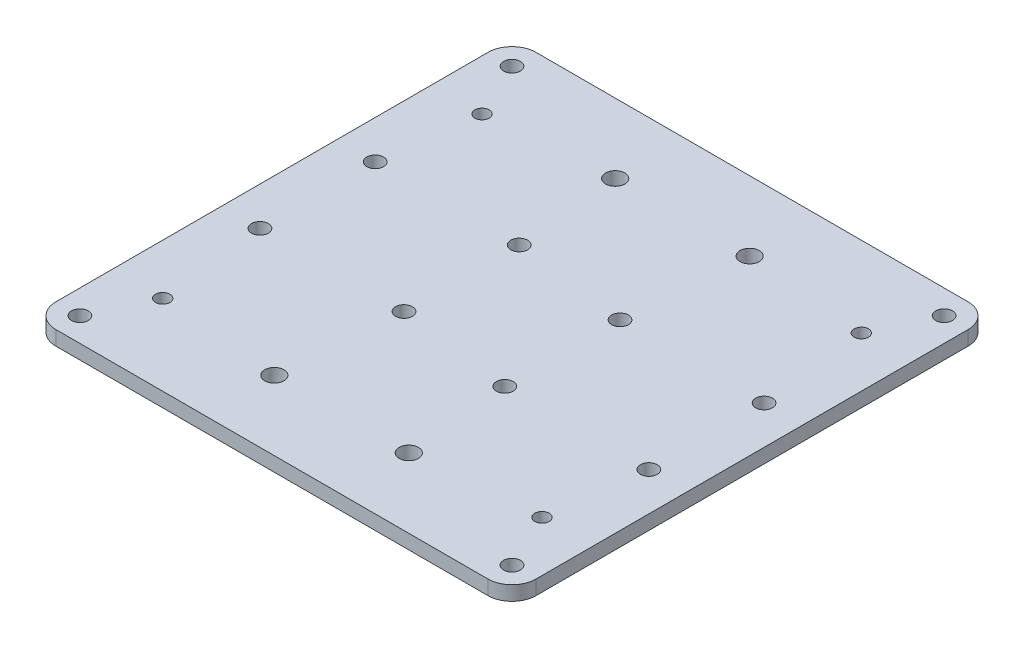
ISO-10303-21;
HEADER;
FILE_DESCRIPTION(('STEP AP214'),'2;1');
FILE_NAME('part.step','',(''),(''),'','','');
FILE_SCHEMA(('AUTOMOTIVE_DESIGN { 1 0 10303 214 1 1 1 1 }'));
ENDSEC;
DATA;
#1=APPLICATION_CONTEXT('core data for automotive mechanical design processes');
#2=APPLICATION_PROTOCOL_DEFINITION('international standard','automotive_design',2000,#1);
#3=PRODUCT_CONTEXT('',#1,'mechanical');
#4=PRODUCT('Part','Part','',(#3));
#5=PRODUCT_RELATED_PRODUCT_CATEGORY('part','',(#4));
#6=PRODUCT_DEFINITION_FORMATION('','',#4);
#7=PRODUCT_DEFINITION_CONTEXT('part definition',#1,'design');
#8=PRODUCT_DEFINITION('design','',#6,#7);
#9=PRODUCT_DEFINITION_SHAPE('','',#8);
#10=(LENGTH_UNIT() NAMED_UNIT(*) SI_UNIT(.MILLI.,.METRE.));
#11=(NAMED_UNIT(*) PLANE_ANGLE_UNIT() SI_UNIT($,.RADIAN.));
#12=(NAMED_UNIT(*) SI_UNIT($,.STERADIAN.) SOLID_ANGLE_UNIT());
#13=UNCERTAINTY_MEASURE_WITH_UNIT(LENGTH_MEASURE(1.E-05),#10,'distance_accuracy_value','');
#14=(GEOMETRIC_REPRESENTATION_CONTEXT(3) GLOBAL_UNCERTAINTY_ASSIGNED_CONTEXT((#13)) GLOBAL_UNIT_ASSIGNED_CONTEXT((#10,
#11,#12)) REPRESENTATION_CONTEXT('',''));
#15=CARTESIAN_POINT('',(0.,0.,0.));
#16=DIRECTION('',(0.,0.,1.));
#17=DIRECTION('',(1.,0.,0.));
#18=AXIS2_PLACEMENT_3D('',#15,#16,#17);
#19=CARTESIAN_POINT('',(45.,3.,45.));
#20=DIRECTION('',(0.,-1.,0.));
#21=DIRECTION('',(0.,0.,-1.));
#22=AXIS2_PLACEMENT_3D('',#19,#20,#21);
#23=PLANE('',#22);
#24=CARTESIAN_POINT('',(45.,3.,45.));
#25=DIRECTION('',(0.,1.,0.));
#26=DIRECTION('',(0.,0.,-1.));
#27=AXIS2_PLACEMENT_3D('',#24,#25,#26);
#28=CIRCLE('',#27,4.99999999999998);
#29=CARTESIAN_POINT('',(45.,3.,50.));
#30=VERTEX_POINT('',#29);
#31=CARTESIAN_POINT('',(50.,3.,45.));
#32=VERTEX_POINT('',#31);
#33=EDGE_CURVE('E147',#30,#32,#28,.T.);
#34=ORIENTED_EDGE('',*,*,#33,.T.);
#35=DIRECTION('',(0.,0.,-1.));
#36=VECTOR('',#35,1.);
#37=CARTESIAN_POINT('',(50.,3.,-45.));
#38=LINE('',#37,#36);
#39=CARTESIAN_POINT('',(50.,3.,-45.));
#40=VERTEX_POINT('',#39);
#41=EDGE_CURVE('E95',#32,#40,#38,.T.);
#42=ORIENTED_EDGE('',*,*,#41,.T.);
#43=CARTESIAN_POINT('',(45.,3.,-45.));
#44=DIRECTION('',(0.,1.,0.));
#45=DIRECTION('',(0.,0.,-1.));
#46=AXIS2_PLACEMENT_3D('',#43,#44,#45);
#47=CIRCLE('',#46,4.99999999999999);
#48=CARTESIAN_POINT('',(45.,3.,-50.));
#49=VERTEX_POINT('',#48);
#50=EDGE_CURVE('E162',#40,#49,#47,.T.);
#51=ORIENTED_EDGE('',*,*,#50,.T.);
#52=DIRECTION('',(-1.,0.,0.));
#53=VECTOR('',#52,1.);
#54=CARTESIAN_POINT('',(-45.,3.,-50.));
#55=LINE('',#54,#53);
#56=CARTESIAN_POINT('',(-45.,3.,-50.));
#57=VERTEX_POINT('',#56);
#58=EDGE_CURVE('E175',#49,#57,#55,.T.);
#59=ORIENTED_EDGE('',*,*,#58,.T.);
#60=CARTESIAN_POINT('',(-45.,3.,-45.));
#61=DIRECTION('',(0.,1.,0.));
#62=DIRECTION('',(0.,0.,-1.));
#63=AXIS2_PLACEMENT_3D('',#60,#61,#62);
#64=CIRCLE('',#63,4.99999999999999);
#65=CARTESIAN_POINT('',(-50.,3.,-45.));
#66=VERTEX_POINT('',#65);
#67=EDGE_CURVE('E114',#57,#66,#64,.T.);
#68=ORIENTED_EDGE('',*,*,#67,.T.);
#69=DIRECTION('',(0.,0.,1.));
#70=VECTOR('',#69,1.);
#71=CARTESIAN_POINT('',(-50.,3.,-45.));
#72=LINE('',#71,#70);
#73=CARTESIAN_POINT('',(-50.,3.,45.));
#74=VERTEX_POINT('',#73);
#75=EDGE_CURVE('E108',#66,#74,#72,.T.);
#76=ORIENTED_EDGE('',*,*,#75,.T.);
#77=CARTESIAN_POINT('',(-45.,3.,45.));
#78=DIRECTION('',(0.,1.,0.));
#79=DIRECTION('',(0.,0.,-1.));
#80=AXIS2_PLACEMENT_3D('',#77,#78,#79);
#81=CIRCLE('',#80,4.99999999999998);
#82=CARTESIAN_POINT('',(-45.,3.,50.));
#83=VERTEX_POINT('',#82);
#84=EDGE_CURVE('E112',#74,#83,#81,.T.);
#85=ORIENTED_EDGE('',*,*,#84,.T.);
#86=DIRECTION('',(1.,0.,0.));
#87=VECTOR('',#86,1.);
#88=CARTESIAN_POINT('',(-45.,3.,50.));
#89=LINE('',#88,#87);
#90=EDGE_CURVE('E52',#83,#30,#89,.T.);
#91=ORIENTED_EDGE('',*,*,#90,.T.);
#92=EDGE_LOOP('',(#34,#42,#51,#59,#68,#76,#85,#91));
#93=FACE_BOUND('',#92,.T.);
#94=CARTESIAN_POINT('',(-45.,3.,-45.));
#95=DIRECTION('',(0.,1.,0.));
#96=DIRECTION('',(0.,0.,1.));
#97=AXIS2_PLACEMENT_3D('',#94,#95,#96);
#98=CIRCLE('',#97,1.75);
#99=CARTESIAN_POINT('',(-45.,3.,-43.25));
#100=VERTEX_POINT('',#99);
#101=EDGE_CURVE('E136',#100,#100,#98,.T.);
#102=ORIENTED_EDGE('',*,*,#101,.F.);
#103=EDGE_LOOP('',(#102));
#104=FACE_BOUND('',#103,.T.);
#105=CARTESIAN_POINT('',(45.,3.,-45.));
#106=DIRECTION('',(0.,1.,0.));
#107=DIRECTION('',(0.,0.,1.));
#108=AXIS2_PLACEMENT_3D('',#105,#106,#107);
#109=CIRCLE('',#108,1.75);
#110=CARTESIAN_POINT('',(45.,3.,-43.25));
#111=VERTEX_POINT('',#110);
#112=EDGE_CURVE('E184',#111,#111,#109,.T.);
#113=ORIENTED_EDGE('',*,*,#112,.F.);
#114=EDGE_LOOP('',(#113));
#115=FACE_BOUND('',#114,.T.);
#116=CARTESIAN_POINT('',(14.,3.,35.4999999999999));
#117=DIRECTION('',(0.,1.,0.));
#118=DIRECTION('',(0.,0.,1.));
#119=AXIS2_PLACEMENT_3D('',#116,#117,#118);
#120=CIRCLE('',#119,1.99999999999999);
#121=CARTESIAN_POINT('',(14.,3.,37.4999999999999));
#122=VERTEX_POINT('',#121);
#123=EDGE_CURVE('E190',#122,#122,#120,.T.);
#124=ORIENTED_EDGE('',*,*,#123,.F.);
#125=EDGE_LOOP('',(#124));
#126=FACE_BOUND('',#125,.T.);
#127=CARTESIAN_POINT('',(-45.,3.,45.));
#128=DIRECTION('',(0.,1.,0.));
#129=DIRECTION('',(0.,0.,1.));
#130=AXIS2_PLACEMENT_3D('',#127,#128,#129);
#131=CIRCLE('',#130,1.75);
#132=CARTESIAN_POINT('',(-45.,3.,46.75));
#133=VERTEX_POINT('',#132);
#134=EDGE_CURVE('E196',#133,#133,#131,.T.);
#135=ORIENTED_EDGE('',*,*,#134,.F.);
#136=EDGE_LOOP('',(#135));
#137=FACE_BOUND('',#136,.T.);
#138=CARTESIAN_POINT('',(45.,3.,45.));
#139=DIRECTION('',(0.,1.,0.));
#140=DIRECTION('',(0.,0.,1.));
#141=AXIS2_PLACEMENT_3D('',#138,#139,#140);
#142=CIRCLE('',#141,1.75);
#143=CARTESIAN_POINT('',(45.,3.,46.75));
#144=VERTEX_POINT('',#143);
#145=EDGE_CURVE('E202',#144,#144,#142,.T.);
#146=ORIENTED_EDGE('',*,*,#145,.F.);
#147=EDGE_LOOP('',(#146));
#148=FACE_BOUND('',#147,.T.);
#149=CARTESIAN_POINT('',(-14.,3.,-35.5));
#150=DIRECTION('',(0.,1.,0.));
#151=DIRECTION('',(0.,0.,1.));
#152=AXIS2_PLACEMENT_3D('',#149,#150,#151);
#153=CIRCLE('',#152,2.);
#154=CARTESIAN_POINT('',(-14.,3.,-33.5));
#155=VERTEX_POINT('',#154);
#156=EDGE_CURVE('E208',#155,#155,#153,.T.);
#157=ORIENTED_EDGE('',*,*,#156,.F.);
#158=EDGE_LOOP('',(#157));
#159=FACE_BOUND('',#158,.T.);
#160=CARTESIAN_POINT('',(-14.,3.,35.5));
#161=DIRECTION('',(0.,1.,0.));
#162=DIRECTION('',(0.,0.,1.));
#163=AXIS2_PLACEMENT_3D('',#160,#161,#162);
#164=CIRCLE('',#163,2.);
#165=CARTESIAN_POINT('',(-14.,3.,37.5));
#166=VERTEX_POINT('',#165);
#167=EDGE_CURVE('E214',#166,#166,#164,.T.);
#168=ORIENTED_EDGE('',*,*,#167,.F.);
#169=EDGE_LOOP('',(#168));
#170=FACE_BOUND('',#169,.T.);
#171=CARTESIAN_POINT('',(12.,3.,-10.5));
#172=DIRECTION('',(0.,1.,0.));
#173=DIRECTION('',(0.,0.,1.));
#174=AXIS2_PLACEMENT_3D('',#171,#172,#173);
#175=CIRCLE('',#174,1.75);
#176=CARTESIAN_POINT('',(12.,3.,-8.75000000000001));
#177=VERTEX_POINT('',#176);
#178=EDGE_CURVE('E220',#177,#177,#175,.T.);
#179=ORIENTED_EDGE('',*,*,#178,.F.);
#180=EDGE_LOOP('',(#179));
#181=FACE_BOUND('',#180,.T.);
#182=CARTESIAN_POINT('',(42.,3.,-10.5));
#183=DIRECTION('',(0.,1.,0.));
#184=DIRECTION('',(0.,0.,1.));
#185=AXIS2_PLACEMENT_3D('',#182,#183,#184);
#186=CIRCLE('',#185,1.75);
#187=CARTESIAN_POINT('',(42.,3.,-8.75000000000001));
#188=VERTEX_POINT('',#187);
#189=EDGE_CURVE('E226',#188,#188,#186,.T.);
#190=ORIENTED_EDGE('',*,*,#189,.F.);
#191=EDGE_LOOP('',(#190));
#192=FACE_BOUND('',#191,.T.);
#193=CARTESIAN_POINT('',(12.,3.,13.5));
#194=DIRECTION('',(0.,1.,0.));
#195=DIRECTION('',(0.,0.,1.));
#196=AXIS2_PLACEMENT_3D('',#193,#194,#195);
#197=CIRCLE('',#196,1.75);
#198=CARTESIAN_POINT('',(12.,3.,15.25));
#199=VERTEX_POINT('',#198);
#200=EDGE_CURVE('E232',#199,#199,#197,.T.);
#201=ORIENTED_EDGE('',*,*,#200,.F.);
#202=EDGE_LOOP('',(#201));
#203=FACE_BOUND('',#202,.T.);
#204=CARTESIAN_POINT('',(42.,3.,13.5));
#205=DIRECTION('',(0.,1.,0.));
#206=DIRECTION('',(0.,0.,1.));
#207=AXIS2_PLACEMENT_3D('',#204,#205,#206);
#208=CIRCLE('',#207,1.75);
#209=CARTESIAN_POINT('',(42.,3.,15.25));
#210=VERTEX_POINT('',#209);
#211=EDGE_CURVE('E238',#210,#210,#208,.T.);
#212=ORIENTED_EDGE('',*,*,#211,.F.);
#213=EDGE_LOOP('',(#212));
#214=FACE_BOUND('',#213,.T.);
#215=CARTESIAN_POINT('',(-42.,3.,-13.5));
#216=DIRECTION('',(0.,1.,0.));
#217=DIRECTION('',(0.,0.,1.));
#218=AXIS2_PLACEMENT_3D('',#215,#216,#217);
#219=CIRCLE('',#218,1.75000000000001);
#220=CARTESIAN_POINT('',(-42.,3.,-11.75));
#221=VERTEX_POINT('',#220);
#222=EDGE_CURVE('E244',#221,#221,#219,.T.);
#223=ORIENTED_EDGE('',*,*,#222,.F.);
#224=EDGE_LOOP('',(#223));
#225=FACE_BOUND('',#224,.T.);
#226=CARTESIAN_POINT('',(-12.,3.,-13.5));
#227=DIRECTION('',(0.,1.,0.));
#228=DIRECTION('',(0.,0.,1.));
#229=AXIS2_PLACEMENT_3D('',#226,#227,#228);
#230=CIRCLE('',#229,1.75);
#231=CARTESIAN_POINT('',(-12.,3.,-11.75));
#232=VERTEX_POINT('',#231);
#233=EDGE_CURVE('E250',#232,#232,#230,.T.);
#234=ORIENTED_EDGE('',*,*,#233,.F.);
#235=EDGE_LOOP('',(#234));
#236=FACE_BOUND('',#235,.T.);
#237=CARTESIAN_POINT('',(-42.,3.,10.5));
#238=DIRECTION('',(0.,1.,0.));
#239=DIRECTION('',(0.,0.,1.));
#240=AXIS2_PLACEMENT_3D('',#237,#238,#239);
#241=CIRCLE('',#240,1.75);
#242=CARTESIAN_POINT('',(-42.,3.,12.25));
#243=VERTEX_POINT('',#242);
#244=EDGE_CURVE('E256',#243,#243,#241,.T.);
#245=ORIENTED_EDGE('',*,*,#244,.F.);
#246=EDGE_LOOP('',(#245));
#247=FACE_BOUND('',#246,.T.);
#248=CARTESIAN_POINT('',(-12.,3.,10.5));
#249=DIRECTION('',(0.,1.,0.));
#250=DIRECTION('',(0.,0.,1.));
#251=AXIS2_PLACEMENT_3D('',#248,#249,#250);
#252=CIRCLE('',#251,1.75);
#253=CARTESIAN_POINT('',(-12.,3.,12.25));
#254=VERTEX_POINT('',#253);
#255=EDGE_CURVE('E262',#254,#254,#252,.T.);
#256=ORIENTED_EDGE('',*,*,#255,.F.);
#257=EDGE_LOOP('',(#256));
#258=FACE_BOUND('',#257,.T.);
#259=CARTESIAN_POINT('',(14.,3.,-35.5000000000001));
#260=DIRECTION('',(0.,1.,0.));
#261=DIRECTION('',(0.,0.,1.));
#262=AXIS2_PLACEMENT_3D('',#259,#260,#261);
#263=CIRCLE('',#262,1.99999999999998);
#264=CARTESIAN_POINT('',(14.,3.,-33.5000000000001));
#265=VERTEX_POINT('',#264);
#266=EDGE_CURVE('E268',#265,#265,#263,.T.);
#267=ORIENTED_EDGE('',*,*,#266,.F.);
#268=EDGE_LOOP('',(#267));
#269=FACE_BOUND('',#268,.T.);
#270=CARTESIAN_POINT('',(-39.5,3.,-33.25));
#271=DIRECTION('',(0.,1.,0.));
#272=DIRECTION('',(0.,0.,1.));
#273=AXIS2_PLACEMENT_3D('',#270,#271,#272);
#274=CIRCLE('',#273,1.5);
#275=CARTESIAN_POINT('',(-39.5,3.,-31.75));
#276=VERTEX_POINT('',#275);
#277=EDGE_CURVE('E274',#276,#276,#274,.T.);
#278=ORIENTED_EDGE('',*,*,#277,.F.);
#279=EDGE_LOOP('',(#278));
#280=FACE_BOUND('',#279,.T.);
#281=CARTESIAN_POINT('',(39.5,3.,-33.25));
#282=DIRECTION('',(0.,1.,0.));
#283=DIRECTION('',(0.,0.,1.));
#284=AXIS2_PLACEMENT_3D('',#281,#282,#283);
#285=CIRCLE('',#284,1.5);
#286=CARTESIAN_POINT('',(39.5,3.,-31.75));
#287=VERTEX_POINT('',#286);
#288=EDGE_CURVE('E280',#287,#287,#285,.T.);
#289=ORIENTED_EDGE('',*,*,#288,.F.);
#290=EDGE_LOOP('',(#289));
#291=FACE_BOUND('',#290,.T.);
#292=CARTESIAN_POINT('',(-39.5,3.,33.25));
#293=DIRECTION('',(0.,1.,0.));
#294=DIRECTION('',(0.,0.,1.));
#295=AXIS2_PLACEMENT_3D('',#292,#293,#294);
#296=CIRCLE('',#295,1.5);
#297=CARTESIAN_POINT('',(-39.5,3.,34.75));
#298=VERTEX_POINT('',#297);
#299=EDGE_CURVE('E286',#298,#298,#296,.T.);
#300=ORIENTED_EDGE('',*,*,#299,.F.);
#301=EDGE_LOOP('',(#300));
#302=FACE_BOUND('',#301,.T.);
#303=CARTESIAN_POINT('',(39.5,3.,33.25));
#304=DIRECTION('',(0.,1.,0.));
#305=DIRECTION('',(0.,0.,1.));
#306=AXIS2_PLACEMENT_3D('',#303,#304,#305);
#307=CIRCLE('',#306,1.5);
#308=CARTESIAN_POINT('',(39.5,3.,34.75));
#309=VERTEX_POINT('',#308);
#310=EDGE_CURVE('E292',#309,#309,#307,.T.);
#311=ORIENTED_EDGE('',*,*,#310,.F.);
#312=EDGE_LOOP('',(#311));
#313=FACE_BOUND('',#312,.T.);
#314=ADVANCED_FACE('F35',(#93,#104,#115,#126,#137,#148,#159,#170,#181,#192,#203,#214,#225,#236,
#247,#258,#269,#280,#291,#302,#313),#23,.F.);
#315=CARTESIAN_POINT('',(45.,0.,45.));
#316=DIRECTION('',(0.,-1.,0.));
#317=DIRECTION('',(0.,0.,-1.));
#318=AXIS2_PLACEMENT_3D('',#315,#316,#317);
#319=PLANE('',#318);
#320=CARTESIAN_POINT('',(-39.5,0.,33.25));
#321=DIRECTION('',(0.,1.,0.));
#322=DIRECTION('',(0.,0.,1.));
#323=AXIS2_PLACEMENT_3D('',#320,#321,#322);
#324=CIRCLE('',#323,1.5);
#325=CARTESIAN_POINT('',(-39.5,0.,34.75));
#326=VERTEX_POINT('',#325);
#327=EDGE_CURVE('E289',#326,#326,#324,.T.);
#328=ORIENTED_EDGE('',*,*,#327,.T.);
#329=EDGE_LOOP('',(#328));
#330=FACE_BOUND('',#329,.T.);
#331=CARTESIAN_POINT('',(-39.5,0.,-33.25));
#332=DIRECTION('',(0.,1.,0.));
#333=DIRECTION('',(0.,0.,1.));
#334=AXIS2_PLACEMENT_3D('',#331,#332,#333);
#335=CIRCLE('',#334,1.5);
#336=CARTESIAN_POINT('',(-39.5,0.,-31.75));
#337=VERTEX_POINT('',#336);
#338=EDGE_CURVE('E277',#337,#337,#335,.T.);
#339=ORIENTED_EDGE('',*,*,#338,.T.);
#340=EDGE_LOOP('',(#339));
#341=FACE_BOUND('',#340,.T.);
#342=CARTESIAN_POINT('',(-12.,0.,10.5));
#343=DIRECTION('',(0.,1.,0.));
#344=DIRECTION('',(0.,0.,1.));
#345=AXIS2_PLACEMENT_3D('',#342,#343,#344);
#346=CIRCLE('',#345,1.75);
#347=CARTESIAN_POINT('',(-12.,0.,12.25));
#348=VERTEX_POINT('',#347);
#349=EDGE_CURVE('E265',#348,#348,#346,.T.);
#350=ORIENTED_EDGE('',*,*,#349,.T.);
#351=EDGE_LOOP('',(#350));
#352=FACE_BOUND('',#351,.T.);
#353=CARTESIAN_POINT('',(-12.,0.,-13.5));
#354=DIRECTION('',(0.,1.,0.));
#355=DIRECTION('',(0.,0.,1.));
#356=AXIS2_PLACEMENT_3D('',#353,#354,#355);
#357=CIRCLE('',#356,1.75);
#358=CARTESIAN_POINT('',(-12.,0.,-11.75));
#359=VERTEX_POINT('',#358);
#360=EDGE_CURVE('E253',#359,#359,#357,.T.);
#361=ORIENTED_EDGE('',*,*,#360,.T.);
#362=EDGE_LOOP('',(#361));
#363=FACE_BOUND('',#362,.T.);
#364=CARTESIAN_POINT('',(42.,0.,13.5));
#365=DIRECTION('',(0.,1.,0.));
#366=DIRECTION('',(0.,0.,1.));
#367=AXIS2_PLACEMENT_3D('',#364,#365,#366);
#368=CIRCLE('',#367,1.75);
#369=CARTESIAN_POINT('',(42.,0.,15.25));
#370=VERTEX_POINT('',#369);
#371=EDGE_CURVE('E241',#370,#370,#368,.T.);
#372=ORIENTED_EDGE('',*,*,#371,.T.);
#373=EDGE_LOOP('',(#372));
#374=FACE_BOUND('',#373,.T.);
#375=CARTESIAN_POINT('',(42.,0.,-10.5));
#376=DIRECTION('',(0.,1.,0.));
#377=DIRECTION('',(0.,0.,1.));
#378=AXIS2_PLACEMENT_3D('',#375,#376,#377);
#379=CIRCLE('',#378,1.75);
#380=CARTESIAN_POINT('',(42.,0.,-8.75000000000001));
#381=VERTEX_POINT('',#380);
#382=EDGE_CURVE('E229',#381,#381,#379,.T.);
#383=ORIENTED_EDGE('',*,*,#382,.T.);
#384=EDGE_LOOP('',(#383));
#385=FACE_BOUND('',#384,.T.);
#386=CARTESIAN_POINT('',(-14.,0.,35.5));
#387=DIRECTION('',(0.,1.,0.));
#388=DIRECTION('',(0.,0.,1.));
#389=AXIS2_PLACEMENT_3D('',#386,#387,#388);
#390=CIRCLE('',#389,2.);
#391=CARTESIAN_POINT('',(-14.,0.,37.5));
#392=VERTEX_POINT('',#391);
#393=EDGE_CURVE('E217',#392,#392,#390,.T.);
#394=ORIENTED_EDGE('',*,*,#393,.T.);
#395=EDGE_LOOP('',(#394));
#396=FACE_BOUND('',#395,.T.);
#397=CARTESIAN_POINT('',(45.,0.,45.));
#398=DIRECTION('',(0.,1.,0.));
#399=DIRECTION('',(0.,0.,1.));
#400=AXIS2_PLACEMENT_3D('',#397,#398,#399);
#401=CIRCLE('',#400,1.75);
#402=CARTESIAN_POINT('',(45.,0.,46.75));
#403=VERTEX_POINT('',#402);
#404=EDGE_CURVE('E205',#403,#403,#401,.T.);
#405=ORIENTED_EDGE('',*,*,#404,.T.);
#406=EDGE_LOOP('',(#405));
#407=FACE_BOUND('',#406,.T.);
#408=CARTESIAN_POINT('',(14.,0.,35.4999999999999));
#409=DIRECTION('',(0.,1.,0.));
#410=DIRECTION('',(0.,0.,1.));
#411=AXIS2_PLACEMENT_3D('',#408,#409,#410);
#412=CIRCLE('',#411,1.99999999999999);
#413=CARTESIAN_POINT('',(14.,0.,37.4999999999999));
#414=VERTEX_POINT('',#413);
#415=EDGE_CURVE('E193',#414,#414,#412,.T.);
#416=ORIENTED_EDGE('',*,*,#415,.T.);
#417=EDGE_LOOP('',(#416));
#418=FACE_BOUND('',#417,.T.);
#419=CARTESIAN_POINT('',(-45.,0.,-45.));
#420=DIRECTION('',(0.,1.,0.));
#421=DIRECTION('',(0.,0.,1.));
#422=AXIS2_PLACEMENT_3D('',#419,#420,#421);
#423=CIRCLE('',#422,1.75);
#424=CARTESIAN_POINT('',(-45.,0.,-43.25));
#425=VERTEX_POINT('',#424);
#426=EDGE_CURVE('E181',#425,#425,#423,.T.);
#427=ORIENTED_EDGE('',*,*,#426,.T.);
#428=EDGE_LOOP('',(#427));
#429=FACE_BOUND('',#428,.T.);
#430=CARTESIAN_POINT('',(45.,0.,45.));
#431=DIRECTION('',(0.,1.,0.));
#432=DIRECTION('',(0.,0.,-1.));
#433=AXIS2_PLACEMENT_3D('',#430,#431,#432);
#434=CIRCLE('',#433,4.99999999999998);
#435=CARTESIAN_POINT('',(45.,0.,50.));
#436=VERTEX_POINT('',#435);
#437=CARTESIAN_POINT('',(50.,0.,45.));
#438=VERTEX_POINT('',#437);
#439=EDGE_CURVE('E132',#436,#438,#434,.T.);
#440=ORIENTED_EDGE('',*,*,#439,.F.);
#441=DIRECTION('',(1.,0.,0.));
#442=VECTOR('',#441,1.);
#443=CARTESIAN_POINT('',(-45.,0.,50.));
#444=LINE('',#443,#442);
#445=CARTESIAN_POINT('',(-45.,0.,50.));
#446=VERTEX_POINT('',#445);
#447=EDGE_CURVE('E87',#446,#436,#444,.T.);
#448=ORIENTED_EDGE('',*,*,#447,.F.);
#449=CARTESIAN_POINT('',(-45.,0.,45.));
#450=DIRECTION('',(0.,1.,0.));
#451=DIRECTION('',(0.,0.,-1.));
#452=AXIS2_PLACEMENT_3D('',#449,#450,#451);
#453=CIRCLE('',#452,4.99999999999998);
#454=CARTESIAN_POINT('',(-50.,0.,45.));
#455=VERTEX_POINT('',#454);
#456=EDGE_CURVE('E81',#455,#446,#453,.T.);
#457=ORIENTED_EDGE('',*,*,#456,.F.);
#458=DIRECTION('',(0.,0.,1.));
#459=VECTOR('',#458,1.);
#460=CARTESIAN_POINT('',(-50.,0.,-45.));
#461=LINE('',#460,#459);
#462=CARTESIAN_POINT('',(-50.,0.,-45.));
#463=VERTEX_POINT('',#462);
#464=EDGE_CURVE('E122',#463,#455,#461,.T.);
#465=ORIENTED_EDGE('',*,*,#464,.F.);
#466=CARTESIAN_POINT('',(-45.,0.,-45.));
#467=DIRECTION('',(0.,1.,0.));
#468=DIRECTION('',(0.,0.,-1.));
#469=AXIS2_PLACEMENT_3D('',#466,#467,#468);
#470=CIRCLE('',#469,4.99999999999999);
#471=CARTESIAN_POINT('',(-45.,0.,-50.));
#472=VERTEX_POINT('',#471);
#473=EDGE_CURVE('E142',#472,#463,#470,.T.);
#474=ORIENTED_EDGE('',*,*,#473,.F.);
#475=DIRECTION('',(-1.,0.,0.));
#476=VECTOR('',#475,1.);
#477=CARTESIAN_POINT('',(-45.,0.,-50.));
#478=LINE('',#477,#476);
#479=CARTESIAN_POINT('',(45.,0.,-50.));
#480=VERTEX_POINT('',#479);
#481=EDGE_CURVE('E140',#480,#472,#478,.T.);
#482=ORIENTED_EDGE('',*,*,#481,.F.);
#483=CARTESIAN_POINT('',(45.,0.,-45.));
#484=DIRECTION('',(0.,1.,0.));
#485=DIRECTION('',(0.,0.,-1.));
#486=AXIS2_PLACEMENT_3D('',#483,#484,#485);
#487=CIRCLE('',#486,4.99999999999999);
#488=CARTESIAN_POINT('',(50.,0.,-45.));
#489=VERTEX_POINT('',#488);
#490=EDGE_CURVE('E138',#489,#480,#487,.T.);
#491=ORIENTED_EDGE('',*,*,#490,.F.);
#492=DIRECTION('',(0.,0.,-1.));
#493=VECTOR('',#492,1.);
#494=CARTESIAN_POINT('',(50.,0.,-45.));
#495=LINE('',#494,#493);
#496=EDGE_CURVE('E135',#438,#489,#495,.T.);
#497=ORIENTED_EDGE('',*,*,#496,.F.);
#498=EDGE_LOOP('',(#440,#448,#457,#465,#474,#482,#491,#497));
#499=FACE_BOUND('',#498,.T.);
#500=CARTESIAN_POINT('',(45.,0.,-45.));
#501=DIRECTION('',(0.,1.,0.));
#502=DIRECTION('',(0.,0.,1.));
#503=AXIS2_PLACEMENT_3D('',#500,#501,#502);
#504=CIRCLE('',#503,1.75);
#505=CARTESIAN_POINT('',(45.,0.,-43.25));
#506=VERTEX_POINT('',#505);
#507=EDGE_CURVE('E187',#506,#506,#504,.T.);
#508=ORIENTED_EDGE('',*,*,#507,.T.);
#509=EDGE_LOOP('',(#508));
#510=FACE_BOUND('',#509,.T.);
#511=CARTESIAN_POINT('',(-45.,0.,45.));
#512=DIRECTION('',(0.,1.,0.));
#513=DIRECTION('',(0.,0.,1.));
#514=AXIS2_PLACEMENT_3D('',#511,#512,#513);
#515=CIRCLE('',#514,1.75);
#516=CARTESIAN_POINT('',(-45.,0.,46.75));
#517=VERTEX_POINT('',#516);
#518=EDGE_CURVE('E199',#517,#517,#515,.T.);
#519=ORIENTED_EDGE('',*,*,#518,.T.);
#520=EDGE_LOOP('',(#519));
#521=FACE_BOUND('',#520,.T.);
#522=CARTESIAN_POINT('',(-14.,0.,-35.5));
#523=DIRECTION('',(0.,1.,0.));
#524=DIRECTION('',(0.,0.,1.));
#525=AXIS2_PLACEMENT_3D('',#522,#523,#524);
#526=CIRCLE('',#525,2.);
#527=CARTESIAN_POINT('',(-14.,0.,-33.5));
#528=VERTEX_POINT('',#527);
#529=EDGE_CURVE('E211',#528,#528,#526,.T.);
#530=ORIENTED_EDGE('',*,*,#529,.T.);
#531=EDGE_LOOP('',(#530));
#532=FACE_BOUND('',#531,.T.);
#533=CARTESIAN_POINT('',(12.,0.,-10.5));
#534=DIRECTION('',(0.,1.,0.));
#535=DIRECTION('',(0.,0.,1.));
#536=AXIS2_PLACEMENT_3D('',#533,#534,#535);
#537=CIRCLE('',#536,1.75);
#538=CARTESIAN_POINT('',(12.,0.,-8.75000000000001));
#539=VERTEX_POINT('',#538);
#540=EDGE_CURVE('E223',#539,#539,#537,.T.);
#541=ORIENTED_EDGE('',*,*,#540,.T.);
#542=EDGE_LOOP('',(#541));
#543=FACE_BOUND('',#542,.T.);
#544=CARTESIAN_POINT('',(12.,0.,13.5));
#545=DIRECTION('',(0.,1.,0.));
#546=DIRECTION('',(0.,0.,1.));
#547=AXIS2_PLACEMENT_3D('',#544,#545,#546);
#548=CIRCLE('',#547,1.75);
#549=CARTESIAN_POINT('',(12.,0.,15.25));
#550=VERTEX_POINT('',#549);
#551=EDGE_CURVE('E235',#550,#550,#548,.T.);
#552=ORIENTED_EDGE('',*,*,#551,.T.);
#553=EDGE_LOOP('',(#552));
#554=FACE_BOUND('',#553,.T.);
#555=CARTESIAN_POINT('',(-42.,0.,-13.5));
#556=DIRECTION('',(0.,1.,0.));
#557=DIRECTION('',(0.,0.,1.));
#558=AXIS2_PLACEMENT_3D('',#555,#556,#557);
#559=CIRCLE('',#558,1.75000000000001);
#560=CARTESIAN_POINT('',(-42.,0.,-11.75));
#561=VERTEX_POINT('',#560);
#562=EDGE_CURVE('E247',#561,#561,#559,.T.);
#563=ORIENTED_EDGE('',*,*,#562,.T.);
#564=EDGE_LOOP('',(#563));
#565=FACE_BOUND('',#564,.T.);
#566=CARTESIAN_POINT('',(-42.,0.,10.5));
#567=DIRECTION('',(0.,1.,0.));
#568=DIRECTION('',(0.,0.,1.));
#569=AXIS2_PLACEMENT_3D('',#566,#567,#568);
#570=CIRCLE('',#569,1.75);
#571=CARTESIAN_POINT('',(-42.,0.,12.25));
#572=VERTEX_POINT('',#571);
#573=EDGE_CURVE('E259',#572,#572,#570,.T.);
#574=ORIENTED_EDGE('',*,*,#573,.T.);
#575=EDGE_LOOP('',(#574));
#576=FACE_BOUND('',#575,.T.);
#577=CARTESIAN_POINT('',(14.,0.,-35.5000000000001));
#578=DIRECTION('',(0.,1.,0.));
#579=DIRECTION('',(0.,0.,1.));
#580=AXIS2_PLACEMENT_3D('',#577,#578,#579);
#581=CIRCLE('',#580,1.99999999999998);
#582=CARTESIAN_POINT('',(14.,0.,-33.5000000000001));
#583=VERTEX_POINT('',#582);
#584=EDGE_CURVE('E271',#583,#583,#581,.T.);
#585=ORIENTED_EDGE('',*,*,#584,.T.);
#586=EDGE_LOOP('',(#585));
#587=FACE_BOUND('',#586,.T.);
#588=CARTESIAN_POINT('',(39.5,0.,-33.25));
#589=DIRECTION('',(0.,1.,0.));
#590=DIRECTION('',(0.,0.,1.));
#591=AXIS2_PLACEMENT_3D('',#588,#589,#590);
#592=CIRCLE('',#591,1.5);
#593=CARTESIAN_POINT('',(39.5,0.,-31.75));
#594=VERTEX_POINT('',#593);
#595=EDGE_CURVE('E283',#594,#594,#592,.T.);
#596=ORIENTED_EDGE('',*,*,#595,.T.);
#597=EDGE_LOOP('',(#596));
#598=FACE_BOUND('',#597,.T.);
#599=CARTESIAN_POINT('',(39.5,0.,33.25));
#600=DIRECTION('',(0.,1.,0.));
#601=DIRECTION('',(0.,0.,1.));
#602=AXIS2_PLACEMENT_3D('',#599,#600,#601);
#603=CIRCLE('',#602,1.5);
#604=CARTESIAN_POINT('',(39.5,0.,34.75));
#605=VERTEX_POINT('',#604);
#606=EDGE_CURVE('E295',#605,#605,#603,.T.);
#607=ORIENTED_EDGE('',*,*,#606,.T.);
#608=EDGE_LOOP('',(#607));
#609=FACE_BOUND('',#608,.T.);
#610=ADVANCED_FACE('F166',(#330,#341,#352,#363,#374,#385,#396,#407,#418,#429,#499,#510,#521,
#532,#543,#554,#565,#576,#587,#598,#609),#319,.T.);
#611=CARTESIAN_POINT('',(45.,3.,45.));
#612=DIRECTION('',(0.,-1.,0.));
#613=DIRECTION('',(0.,0.,-1.));
#614=AXIS2_PLACEMENT_3D('',#611,#612,#613);
#615=CYLINDRICAL_SURFACE('',#614,4.99999999999998);
#616=ORIENTED_EDGE('',*,*,#439,.T.);
#617=DIRECTION('',(0.,-1.,0.));
#618=VECTOR('',#617,1.);
#619=CARTESIAN_POINT('',(50.,3.,45.));
#620=LINE('',#619,#618);
#621=EDGE_CURVE('E11',#32,#438,#620,.T.);
#622=ORIENTED_EDGE('',*,*,#621,.F.);
#623=ORIENTED_EDGE('',*,*,#33,.F.);
#624=DIRECTION('',(0.,-1.,0.));
#625=VECTOR('',#624,1.);
#626=CARTESIAN_POINT('',(45.,3.,50.));
#627=LINE('',#626,#625);
#628=EDGE_CURVE('E128',#30,#436,#627,.T.);
#629=ORIENTED_EDGE('',*,*,#628,.T.);
#630=EDGE_LOOP('',(#616,#622,#623,#629));
#631=FACE_BOUND('',#630,.T.);
#632=ADVANCED_FACE('F37',(#631),#615,.T.);
#633=CARTESIAN_POINT('',(50.,3.,-45.));
#634=DIRECTION('',(-1.,0.,0.));
#635=DIRECTION('',(0.,0.,1.));
#636=AXIS2_PLACEMENT_3D('',#633,#634,#635);
#637=PLANE('',#636);
#638=ORIENTED_EDGE('',*,*,#496,.T.);
#639=DIRECTION('',(0.,-1.,0.));
#640=VECTOR('',#639,1.);
#641=CARTESIAN_POINT('',(50.,3.,-45.));
#642=LINE('',#641,#640);
#643=EDGE_CURVE('E44',#40,#489,#642,.T.);
#644=ORIENTED_EDGE('',*,*,#643,.F.);
#645=ORIENTED_EDGE('',*,*,#41,.F.);
#646=ORIENTED_EDGE('',*,*,#621,.T.);
#647=EDGE_LOOP('',(#638,#644,#645,#646));
#648=FACE_BOUND('',#647,.T.);
#649=ADVANCED_FACE('F327',(#648),#637,.F.);
#650=CARTESIAN_POINT('',(45.,3.,-45.));
#651=DIRECTION('',(0.,-1.,0.));
#652=DIRECTION('',(0.,0.,-1.));
#653=AXIS2_PLACEMENT_3D('',#650,#651,#652);
#654=CYLINDRICAL_SURFACE('',#653,4.99999999999999);
#655=ORIENTED_EDGE('',*,*,#490,.T.);
#656=DIRECTION('',(0.,-1.,0.));
#657=VECTOR('',#656,1.);
#658=CARTESIAN_POINT('',(45.,3.,-50.));
#659=LINE('',#658,#657);
#660=EDGE_CURVE('E154',#49,#480,#659,.T.);
#661=ORIENTED_EDGE('',*,*,#660,.F.);
#662=ORIENTED_EDGE('',*,*,#50,.F.);
#663=ORIENTED_EDGE('',*,*,#643,.T.);
#664=EDGE_LOOP('',(#655,#661,#662,#663));
#665=FACE_BOUND('',#664,.T.);
#666=ADVANCED_FACE('F160',(#665),#654,.T.);
#667=CARTESIAN_POINT('',(-45.,3.,-50.));
#668=DIRECTION('',(0.,0.,1.));
#669=DIRECTION('',(1.,0.,0.));
#670=AXIS2_PLACEMENT_3D('',#667,#668,#669);
#671=PLANE('',#670);
#672=ORIENTED_EDGE('',*,*,#481,.T.);
#673=DIRECTION('',(0.,-1.,0.));
#674=VECTOR('',#673,1.);
#675=CARTESIAN_POINT('',(-45.,3.,-50.));
#676=LINE('',#675,#674);
#677=EDGE_CURVE('E151',#57,#472,#676,.T.);
#678=ORIENTED_EDGE('',*,*,#677,.F.);
#679=ORIENTED_EDGE('',*,*,#58,.F.);
#680=ORIENTED_EDGE('',*,*,#660,.T.);
#681=EDGE_LOOP('',(#672,#678,#679,#680));
#682=FACE_BOUND('',#681,.T.);
#683=ADVANCED_FACE('F171',(#682),#671,.F.);
#684=CARTESIAN_POINT('',(-45.,3.,-45.));
#685=DIRECTION('',(0.,-1.,0.));
#686=DIRECTION('',(0.,0.,-1.));
#687=AXIS2_PLACEMENT_3D('',#684,#685,#686);
#688=CYLINDRICAL_SURFACE('',#687,4.99999999999999);
#689=ORIENTED_EDGE('',*,*,#473,.T.);
#690=DIRECTION('',(0.,-1.,0.));
#691=VECTOR('',#690,1.);
#692=CARTESIAN_POINT('',(-50.,3.,-45.));
#693=LINE('',#692,#691);
#694=EDGE_CURVE('E123',#66,#463,#693,.T.);
#695=ORIENTED_EDGE('',*,*,#694,.F.);
#696=ORIENTED_EDGE('',*,*,#67,.F.);
#697=ORIENTED_EDGE('',*,*,#677,.T.);
#698=EDGE_LOOP('',(#689,#695,#696,#697));
#699=FACE_BOUND('',#698,.T.);
#700=ADVANCED_FACE('F174',(#699),#688,.T.);
#701=CARTESIAN_POINT('',(-50.,3.,-45.));
#702=DIRECTION('',(1.,0.,0.));
#703=DIRECTION('',(0.,0.,-1.));
#704=AXIS2_PLACEMENT_3D('',#701,#702,#703);
#705=PLANE('',#704);
#706=ORIENTED_EDGE('',*,*,#464,.T.);
#707=DIRECTION('',(0.,-1.,0.));
#708=VECTOR('',#707,1.);
#709=CARTESIAN_POINT('',(-50.,3.,45.));
#710=LINE('',#709,#708);
#711=EDGE_CURVE('E119',#74,#455,#710,.T.);
#712=ORIENTED_EDGE('',*,*,#711,.F.);
#713=ORIENTED_EDGE('',*,*,#75,.F.);
#714=ORIENTED_EDGE('',*,*,#694,.T.);
#715=EDGE_LOOP('',(#706,#712,#713,#714));
#716=FACE_BOUND('',#715,.T.);
#717=ADVANCED_FACE('F120',(#716),#705,.F.);
#718=CARTESIAN_POINT('',(-45.,3.,45.));
#719=DIRECTION('',(0.,-1.,0.));
#720=DIRECTION('',(0.,0.,-1.));
#721=AXIS2_PLACEMENT_3D('',#718,#719,#720);
#722=CYLINDRICAL_SURFACE('',#721,4.99999999999998);
#723=ORIENTED_EDGE('',*,*,#456,.T.);
#724=DIRECTION('',(0.,-1.,0.));
#725=VECTOR('',#724,1.);
#726=CARTESIAN_POINT('',(-45.,3.,50.));
#727=LINE('',#726,#725);
#728=EDGE_CURVE('E124',#83,#446,#727,.T.);
#729=ORIENTED_EDGE('',*,*,#728,.F.);
#730=ORIENTED_EDGE('',*,*,#84,.F.);
#731=ORIENTED_EDGE('',*,*,#711,.T.);
#732=EDGE_LOOP('',(#723,#729,#730,#731));
#733=FACE_BOUND('',#732,.T.);
#734=ADVANCED_FACE('F126',(#733),#722,.T.);
#735=CARTESIAN_POINT('',(-45.,3.,50.));
#736=DIRECTION('',(0.,0.,-1.));
#737=DIRECTION('',(-1.,0.,0.));
#738=AXIS2_PLACEMENT_3D('',#735,#736,#737);
#739=PLANE('',#738);
#740=ORIENTED_EDGE('',*,*,#447,.T.);
#741=ORIENTED_EDGE('',*,*,#628,.F.);
#742=ORIENTED_EDGE('',*,*,#90,.F.);
#743=ORIENTED_EDGE('',*,*,#728,.T.);
#744=EDGE_LOOP('',(#740,#741,#742,#743));
#745=FACE_BOUND('',#744,.T.);
#746=ADVANCED_FACE('F315',(#745),#739,.F.);
#747=CARTESIAN_POINT('',(-45.,3.,-45.));
#748=DIRECTION('',(0.,-1.,0.));
#749=DIRECTION('',(0.,0.,-1.));
#750=AXIS2_PLACEMENT_3D('',#747,#748,#749);
#751=CYLINDRICAL_SURFACE('',#750,1.75);
#752=ORIENTED_EDGE('',*,*,#101,.T.);
#753=EDGE_LOOP('',(#752));
#754=FACE_BOUND('',#753,.T.);
#755=ORIENTED_EDGE('',*,*,#426,.F.);
#756=EDGE_LOOP('',(#755));
#757=FACE_BOUND('',#756,.T.);
#758=ADVANCED_FACE('F312',(#754,#757),#751,.F.);
#759=CARTESIAN_POINT('',(45.,3.,-45.));
#760=DIRECTION('',(0.,-1.,0.));
#761=DIRECTION('',(0.,0.,-1.));
#762=AXIS2_PLACEMENT_3D('',#759,#760,#761);
#763=CYLINDRICAL_SURFACE('',#762,1.75);
#764=ORIENTED_EDGE('',*,*,#112,.T.);
#765=EDGE_LOOP('',(#764));
#766=FACE_BOUND('',#765,.T.);
#767=ORIENTED_EDGE('',*,*,#507,.F.);
#768=EDGE_LOOP('',(#767));
#769=FACE_BOUND('',#768,.T.);
#770=ADVANCED_FACE('F391',(#766,#769),#763,.F.);
#771=CARTESIAN_POINT('',(14.,3.,35.4999999999999));
#772=DIRECTION('',(0.,-1.,0.));
#773=DIRECTION('',(0.,0.,-1.));
#774=AXIS2_PLACEMENT_3D('',#771,#772,#773);
#775=CYLINDRICAL_SURFACE('',#774,1.99999999999999);
#776=ORIENTED_EDGE('',*,*,#123,.T.);
#777=EDGE_LOOP('',(#776));
#778=FACE_BOUND('',#777,.T.);
#779=ORIENTED_EDGE('',*,*,#415,.F.);
#780=EDGE_LOOP('',(#779));
#781=FACE_BOUND('',#780,.T.);
#782=ADVANCED_FACE('F399',(#778,#781),#775,.F.);
#783=CARTESIAN_POINT('',(-45.,3.,45.));
#784=DIRECTION('',(0.,-1.,0.));
#785=DIRECTION('',(0.,0.,-1.));
#786=AXIS2_PLACEMENT_3D('',#783,#784,#785);
#787=CYLINDRICAL_SURFACE('',#786,1.75);
#788=ORIENTED_EDGE('',*,*,#134,.T.);
#789=EDGE_LOOP('',(#788));
#790=FACE_BOUND('',#789,.T.);
#791=ORIENTED_EDGE('',*,*,#518,.F.);
#792=EDGE_LOOP('',(#791));
#793=FACE_BOUND('',#792,.T.);
#794=ADVANCED_FACE('F407',(#790,#793),#787,.F.);
#795=CARTESIAN_POINT('',(45.,3.,45.));
#796=DIRECTION('',(0.,-1.,0.));
#797=DIRECTION('',(0.,0.,-1.));
#798=AXIS2_PLACEMENT_3D('',#795,#796,#797);
#799=CYLINDRICAL_SURFACE('',#798,1.75);
#800=ORIENTED_EDGE('',*,*,#145,.T.);
#801=EDGE_LOOP('',(#800));
#802=FACE_BOUND('',#801,.T.);
#803=ORIENTED_EDGE('',*,*,#404,.F.);
#804=EDGE_LOOP('',(#803));
#805=FACE_BOUND('',#804,.T.);
#806=ADVANCED_FACE('F416',(#802,#805),#799,.F.);
#807=CARTESIAN_POINT('',(-14.,3.,-35.5));
#808=DIRECTION('',(0.,-1.,0.));
#809=DIRECTION('',(0.,0.,-1.));
#810=AXIS2_PLACEMENT_3D('',#807,#808,#809);
#811=CYLINDRICAL_SURFACE('',#810,2.);
#812=ORIENTED_EDGE('',*,*,#156,.T.);
#813=EDGE_LOOP('',(#812));
#814=FACE_BOUND('',#813,.T.);
#815=ORIENTED_EDGE('',*,*,#529,.F.);
#816=EDGE_LOOP('',(#815));
#817=FACE_BOUND('',#816,.T.);
#818=ADVANCED_FACE('F425',(#814,#817),#811,.F.);
#819=CARTESIAN_POINT('',(-14.,3.,35.5));
#820=DIRECTION('',(0.,-1.,0.));
#821=DIRECTION('',(0.,0.,-1.));
#822=AXIS2_PLACEMENT_3D('',#819,#820,#821);
#823=CYLINDRICAL_SURFACE('',#822,2.);
#824=ORIENTED_EDGE('',*,*,#167,.T.);
#825=EDGE_LOOP('',(#824));
#826=FACE_BOUND('',#825,.T.);
#827=ORIENTED_EDGE('',*,*,#393,.F.);
#828=EDGE_LOOP('',(#827));
#829=FACE_BOUND('',#828,.T.);
#830=ADVANCED_FACE('F434',(#826,#829),#823,.F.);
#831=CARTESIAN_POINT('',(12.,3.,-10.5));
#832=DIRECTION('',(0.,-1.,0.));
#833=DIRECTION('',(0.,0.,-1.));
#834=AXIS2_PLACEMENT_3D('',#831,#832,#833);
#835=CYLINDRICAL_SURFACE('',#834,1.75);
#836=ORIENTED_EDGE('',*,*,#178,.T.);
#837=EDGE_LOOP('',(#836));
#838=FACE_BOUND('',#837,.T.);
#839=ORIENTED_EDGE('',*,*,#540,.F.);
#840=EDGE_LOOP('',(#839));
#841=FACE_BOUND('',#840,.T.);
#842=ADVANCED_FACE('F443',(#838,#841),#835,.F.);
#843=CARTESIAN_POINT('',(42.,3.,-10.5));
#844=DIRECTION('',(0.,-1.,0.));
#845=DIRECTION('',(0.,0.,-1.));
#846=AXIS2_PLACEMENT_3D('',#843,#844,#845);
#847=CYLINDRICAL_SURFACE('',#846,1.75);
#848=ORIENTED_EDGE('',*,*,#189,.T.);
#849=EDGE_LOOP('',(#848));
#850=FACE_BOUND('',#849,.T.);
#851=ORIENTED_EDGE('',*,*,#382,.F.);
#852=EDGE_LOOP('',(#851));
#853=FACE_BOUND('',#852,.T.);
#854=ADVANCED_FACE('F452',(#850,#853),#847,.F.);
#855=CARTESIAN_POINT('',(12.,3.,13.5));
#856=DIRECTION('',(0.,-1.,0.));
#857=DIRECTION('',(0.,0.,-1.));
#858=AXIS2_PLACEMENT_3D('',#855,#856,#857);
#859=CYLINDRICAL_SURFACE('',#858,1.75);
#860=ORIENTED_EDGE('',*,*,#200,.T.);
#861=EDGE_LOOP('',(#860));
#862=FACE_BOUND('',#861,.T.);
#863=ORIENTED_EDGE('',*,*,#551,.F.);
#864=EDGE_LOOP('',(#863));
#865=FACE_BOUND('',#864,.T.);
#866=ADVANCED_FACE('F461',(#862,#865),#859,.F.);
#867=CARTESIAN_POINT('',(42.,3.,13.5));
#868=DIRECTION('',(0.,-1.,0.));
#869=DIRECTION('',(0.,0.,-1.));
#870=AXIS2_PLACEMENT_3D('',#867,#868,#869);
#871=CYLINDRICAL_SURFACE('',#870,1.75);
#872=ORIENTED_EDGE('',*,*,#211,.T.);
#873=EDGE_LOOP('',(#872));
#874=FACE_BOUND('',#873,.T.);
#875=ORIENTED_EDGE('',*,*,#371,.F.);
#876=EDGE_LOOP('',(#875));
#877=FACE_BOUND('',#876,.T.);
#878=ADVANCED_FACE('F470',(#874,#877),#871,.F.);
#879=CARTESIAN_POINT('',(-42.,3.,-13.5));
#880=DIRECTION('',(0.,-1.,0.));
#881=DIRECTION('',(0.,0.,-1.));
#882=AXIS2_PLACEMENT_3D('',#879,#880,#881);
#883=CYLINDRICAL_SURFACE('',#882,1.75000000000001);
#884=ORIENTED_EDGE('',*,*,#222,.T.);
#885=EDGE_LOOP('',(#884));
#886=FACE_BOUND('',#885,.T.);
#887=ORIENTED_EDGE('',*,*,#562,.F.);
#888=EDGE_LOOP('',(#887));
#889=FACE_BOUND('',#888,.T.);
#890=ADVANCED_FACE('F479',(#886,#889),#883,.F.);
#891=CARTESIAN_POINT('',(-12.,3.,-13.5));
#892=DIRECTION('',(0.,-1.,0.));
#893=DIRECTION('',(0.,0.,-1.));
#894=AXIS2_PLACEMENT_3D('',#891,#892,#893);
#895=CYLINDRICAL_SURFACE('',#894,1.75);
#896=ORIENTED_EDGE('',*,*,#233,.T.);
#897=EDGE_LOOP('',(#896));
#898=FACE_BOUND('',#897,.T.);
#899=ORIENTED_EDGE('',*,*,#360,.F.);
#900=EDGE_LOOP('',(#899));
#901=FACE_BOUND('',#900,.T.);
#902=ADVANCED_FACE('F488',(#898,#901),#895,.F.);
#903=CARTESIAN_POINT('',(-42.,3.,10.5));
#904=DIRECTION('',(0.,-1.,0.));
#905=DIRECTION('',(0.,0.,-1.));
#906=AXIS2_PLACEMENT_3D('',#903,#904,#905);
#907=CYLINDRICAL_SURFACE('',#906,1.75);
#908=ORIENTED_EDGE('',*,*,#244,.T.);
#909=EDGE_LOOP('',(#908));
#910=FACE_BOUND('',#909,.T.);
#911=ORIENTED_EDGE('',*,*,#573,.F.);
#912=EDGE_LOOP('',(#911));
#913=FACE_BOUND('',#912,.T.);
#914=ADVANCED_FACE('F497',(#910,#913),#907,.F.);
#915=CARTESIAN_POINT('',(-12.,3.,10.5));
#916=DIRECTION('',(0.,-1.,0.));
#917=DIRECTION('',(0.,0.,-1.));
#918=AXIS2_PLACEMENT_3D('',#915,#916,#917);
#919=CYLINDRICAL_SURFACE('',#918,1.75);
#920=ORIENTED_EDGE('',*,*,#255,.T.);
#921=EDGE_LOOP('',(#920));
#922=FACE_BOUND('',#921,.T.);
#923=ORIENTED_EDGE('',*,*,#349,.F.);
#924=EDGE_LOOP('',(#923));
#925=FACE_BOUND('',#924,.T.);
#926=ADVANCED_FACE('F506',(#922,#925),#919,.F.);
#927=CARTESIAN_POINT('',(14.,3.,-35.5000000000001));
#928=DIRECTION('',(0.,-1.,0.));
#929=DIRECTION('',(0.,0.,-1.));
#930=AXIS2_PLACEMENT_3D('',#927,#928,#929);
#931=CYLINDRICAL_SURFACE('',#930,1.99999999999998);
#932=ORIENTED_EDGE('',*,*,#266,.T.);
#933=EDGE_LOOP('',(#932));
#934=FACE_BOUND('',#933,.T.);
#935=ORIENTED_EDGE('',*,*,#584,.F.);
#936=EDGE_LOOP('',(#935));
#937=FACE_BOUND('',#936,.T.);
#938=ADVANCED_FACE('F515',(#934,#937),#931,.F.);
#939=CARTESIAN_POINT('',(-39.5,3.,-33.25));
#940=DIRECTION('',(0.,-1.,0.));
#941=DIRECTION('',(0.,0.,-1.));
#942=AXIS2_PLACEMENT_3D('',#939,#940,#941);
#943=CYLINDRICAL_SURFACE('',#942,1.5);
#944=ORIENTED_EDGE('',*,*,#277,.T.);
#945=EDGE_LOOP('',(#944));
#946=FACE_BOUND('',#945,.T.);
#947=ORIENTED_EDGE('',*,*,#338,.F.);
#948=EDGE_LOOP('',(#947));
#949=FACE_BOUND('',#948,.T.);
#950=ADVANCED_FACE('F524',(#946,#949),#943,.F.);
#951=CARTESIAN_POINT('',(39.5,3.,-33.25));
#952=DIRECTION('',(0.,-1.,0.));
#953=DIRECTION('',(0.,0.,-1.));
#954=AXIS2_PLACEMENT_3D('',#951,#952,#953);
#955=CYLINDRICAL_SURFACE('',#954,1.5);
#956=ORIENTED_EDGE('',*,*,#288,.T.);
#957=EDGE_LOOP('',(#956));
#958=FACE_BOUND('',#957,.T.);
#959=ORIENTED_EDGE('',*,*,#595,.F.);
#960=EDGE_LOOP('',(#959));
#961=FACE_BOUND('',#960,.T.);
#962=ADVANCED_FACE('F533',(#958,#961),#955,.F.);
#963=CARTESIAN_POINT('',(-39.5,3.,33.25));
#964=DIRECTION('',(0.,-1.,0.));
#965=DIRECTION('',(0.,0.,-1.));
#966=AXIS2_PLACEMENT_3D('',#963,#964,#965);
#967=CYLINDRICAL_SURFACE('',#966,1.5);
#968=ORIENTED_EDGE('',*,*,#299,.T.);
#969=EDGE_LOOP('',(#968));
#970=FACE_BOUND('',#969,.T.);
#971=ORIENTED_EDGE('',*,*,#327,.F.);
#972=EDGE_LOOP('',(#971));
#973=FACE_BOUND('',#972,.T.);
#974=ADVANCED_FACE('F542',(#970,#973),#967,.F.);
#975=CARTESIAN_POINT('',(39.5,3.,33.25));
#976=DIRECTION('',(0.,-1.,0.));
#977=DIRECTION('',(0.,0.,-1.));
#978=AXIS2_PLACEMENT_3D('',#975,#976,#977);
#979=CYLINDRICAL_SURFACE('',#978,1.5);
#980=ORIENTED_EDGE('',*,*,#310,.T.);
#981=EDGE_LOOP('',(#980));
#982=FACE_BOUND('',#981,.T.);
#983=ORIENTED_EDGE('',*,*,#606,.F.);
#984=EDGE_LOOP('',(#983));
#985=FACE_BOUND('',#984,.T.);
#986=ADVANCED_FACE('F301',(#982,#985),#979,.F.);
#987=CLOSED_SHELL('',(#314,#610,#632,#649,#666,#683,#700,#717,#734,#746,#758,#770,#782,#794,
#806,#818,#830,#842,#854,#866,#878,#890,#902,#914,#926,#938,#950,#962,#974,#986));
#988=MANIFOLD_SOLID_BREP('B2',#987);
#989=ADVANCED_BREP_SHAPE_REPRESENTATION('',(#18,#988),#14);
#990=SHAPE_DEFINITION_REPRESENTATION(#9,#989);
ENDSEC;
END-ISO-10303-21;
